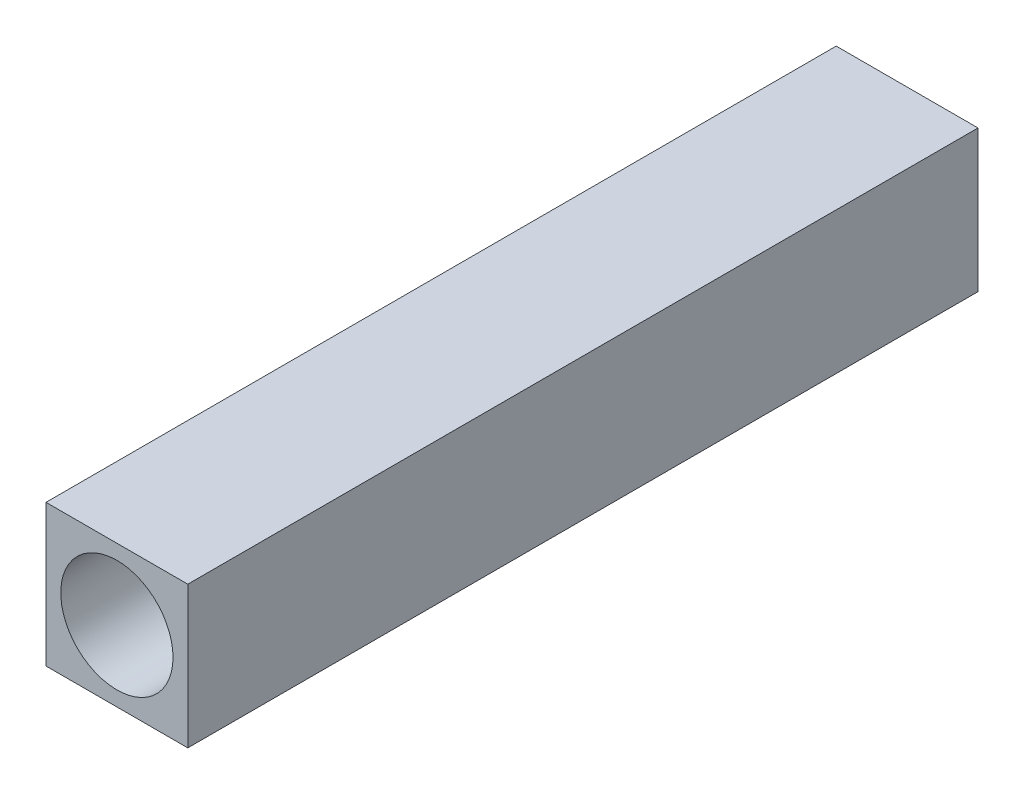
ISO-10303-21;
HEADER;
FILE_DESCRIPTION(('STEP AP214'),'2;1');
FILE_NAME('part.step','',(''),(''),'','','');
FILE_SCHEMA(('AUTOMOTIVE_DESIGN { 1 0 10303 214 1 1 1 1 }'));
ENDSEC;
DATA;
#1=APPLICATION_CONTEXT('core data for automotive mechanical design processes');
#2=APPLICATION_PROTOCOL_DEFINITION('international standard','automotive_design',2000,#1);
#3=PRODUCT_CONTEXT('',#1,'mechanical');
#4=PRODUCT('Part','Part','',(#3));
#5=PRODUCT_RELATED_PRODUCT_CATEGORY('part','',(#4));
#6=PRODUCT_DEFINITION_FORMATION('','',#4);
#7=PRODUCT_DEFINITION_CONTEXT('part definition',#1,'design');
#8=PRODUCT_DEFINITION('design','',#6,#7);
#9=PRODUCT_DEFINITION_SHAPE('','',#8);
#10=(LENGTH_UNIT() NAMED_UNIT(*) SI_UNIT(.MILLI.,.METRE.));
#11=(NAMED_UNIT(*) PLANE_ANGLE_UNIT() SI_UNIT($,.RADIAN.));
#12=(NAMED_UNIT(*) SI_UNIT($,.STERADIAN.) SOLID_ANGLE_UNIT());
#13=UNCERTAINTY_MEASURE_WITH_UNIT(LENGTH_MEASURE(1.E-05),#10,'distance_accuracy_value','');
#14=(GEOMETRIC_REPRESENTATION_CONTEXT(3) GLOBAL_UNCERTAINTY_ASSIGNED_CONTEXT((#13)) GLOBAL_UNIT_ASSIGNED_CONTEXT((#10,
#11,#12)) REPRESENTATION_CONTEXT('',''));
#15=CARTESIAN_POINT('',(0.,0.,0.));
#16=DIRECTION('',(0.,0.,1.));
#17=DIRECTION('',(1.,0.,0.));
#18=AXIS2_PLACEMENT_3D('',#15,#16,#17);
#19=CARTESIAN_POINT('',(0.,0.,135.89));
#20=DIRECTION('',(0.,0.,1.));
#21=DIRECTION('',(1.,0.,0.));
#22=AXIS2_PLACEMENT_3D('',#19,#20,#21);
#23=PLANE('',#22);
#24=DIRECTION('',(0.,-1.,0.));
#25=VECTOR('',#24,1.);
#26=CARTESIAN_POINT('',(12.192,12.192,135.89));
#27=LINE('',#26,#25);
#28=CARTESIAN_POINT('',(12.192,12.192,135.89));
#29=VERTEX_POINT('',#28);
#30=CARTESIAN_POINT('',(12.192,-12.192,135.89));
#31=VERTEX_POINT('',#30);
#32=EDGE_CURVE('E50',#29,#31,#27,.T.);
#33=ORIENTED_EDGE('',*,*,#32,.F.);
#34=DIRECTION('',(1.,0.,0.));
#35=VECTOR('',#34,1.);
#36=CARTESIAN_POINT('',(12.192,12.192,135.89));
#37=LINE('',#36,#35);
#38=CARTESIAN_POINT('',(-12.192,12.192,135.89));
#39=VERTEX_POINT('',#38);
#40=EDGE_CURVE('E79',#39,#29,#37,.T.);
#41=ORIENTED_EDGE('',*,*,#40,.F.);
#42=DIRECTION('',(0.,1.,0.));
#43=VECTOR('',#42,1.);
#44=CARTESIAN_POINT('',(-12.192,12.192,135.89));
#45=LINE('',#44,#43);
#46=CARTESIAN_POINT('',(-12.192,-12.192,135.89));
#47=VERTEX_POINT('',#46);
#48=EDGE_CURVE('E77',#47,#39,#45,.T.);
#49=ORIENTED_EDGE('',*,*,#48,.F.);
#50=DIRECTION('',(-1.,0.,0.));
#51=VECTOR('',#50,1.);
#52=CARTESIAN_POINT('',(12.192,-12.192,135.89));
#53=LINE('',#52,#51);
#54=EDGE_CURVE('E75',#31,#47,#53,.T.);
#55=ORIENTED_EDGE('',*,*,#54,.F.);
#56=EDGE_LOOP('',(#33,#41,#49,#55));
#57=FACE_BOUND('',#56,.T.);
#58=CARTESIAN_POINT('',(0.,0.,135.89));
#59=DIRECTION('',(0.,0.,1.));
#60=DIRECTION('',(1.,0.,0.));
#61=AXIS2_PLACEMENT_3D('',#58,#59,#60);
#62=CIRCLE('',#61,9.652);
#63=CARTESIAN_POINT('',(9.652,0.,135.89));
#64=VERTEX_POINT('',#63);
#65=EDGE_CURVE('E11',#64,#64,#62,.T.);
#66=ORIENTED_EDGE('',*,*,#65,.F.);
#67=EDGE_LOOP('',(#66));
#68=FACE_BOUND('',#67,.T.);
#69=ADVANCED_FACE('F33',(#57,#68),#23,.T.);
#70=CARTESIAN_POINT('',(0.,0.,0.));
#71=DIRECTION('',(0.,0.,1.));
#72=DIRECTION('',(1.,0.,0.));
#73=AXIS2_PLACEMENT_3D('',#70,#71,#72);
#74=PLANE('',#73);
#75=DIRECTION('',(-1.,0.,0.));
#76=VECTOR('',#75,1.);
#77=CARTESIAN_POINT('',(12.192,-12.192,0.));
#78=LINE('',#77,#76);
#79=CARTESIAN_POINT('',(12.192,-12.192,0.));
#80=VERTEX_POINT('',#79);
#81=CARTESIAN_POINT('',(-12.192,-12.192,0.));
#82=VERTEX_POINT('',#81);
#83=EDGE_CURVE('E103',#80,#82,#78,.T.);
#84=ORIENTED_EDGE('',*,*,#83,.T.);
#85=DIRECTION('',(0.,1.,0.));
#86=VECTOR('',#85,1.);
#87=CARTESIAN_POINT('',(-12.192,12.192,0.));
#88=LINE('',#87,#86);
#89=CARTESIAN_POINT('',(-12.192,12.192,0.));
#90=VERTEX_POINT('',#89);
#91=EDGE_CURVE('E66',#82,#90,#88,.T.);
#92=ORIENTED_EDGE('',*,*,#91,.T.);
#93=DIRECTION('',(1.,0.,0.));
#94=VECTOR('',#93,1.);
#95=CARTESIAN_POINT('',(12.192,12.192,0.));
#96=LINE('',#95,#94);
#97=CARTESIAN_POINT('',(12.192,12.192,0.));
#98=VERTEX_POINT('',#97);
#99=EDGE_CURVE('E70',#90,#98,#96,.T.);
#100=ORIENTED_EDGE('',*,*,#99,.T.);
#101=DIRECTION('',(0.,-1.,0.));
#102=VECTOR('',#101,1.);
#103=CARTESIAN_POINT('',(12.192,12.192,0.));
#104=LINE('',#103,#102);
#105=EDGE_CURVE('E105',#98,#80,#104,.T.);
#106=ORIENTED_EDGE('',*,*,#105,.T.);
#107=EDGE_LOOP('',(#84,#92,#100,#106));
#108=FACE_BOUND('',#107,.T.);
#109=CARTESIAN_POINT('',(0.,0.,0.));
#110=DIRECTION('',(0.,0.,1.));
#111=DIRECTION('',(1.,0.,0.));
#112=AXIS2_PLACEMENT_3D('',#109,#110,#111);
#113=CIRCLE('',#112,9.652);
#114=CARTESIAN_POINT('',(9.652,0.,0.));
#115=VERTEX_POINT('',#114);
#116=EDGE_CURVE('E37',#115,#115,#113,.T.);
#117=ORIENTED_EDGE('',*,*,#116,.T.);
#118=EDGE_LOOP('',(#117));
#119=FACE_BOUND('',#118,.T.);
#120=ADVANCED_FACE('F35',(#108,#119),#74,.F.);
#121=CARTESIAN_POINT('',(0.,0.,135.89));
#122=DIRECTION('',(0.,0.,-1.));
#123=DIRECTION('',(-1.,0.,0.));
#124=AXIS2_PLACEMENT_3D('',#121,#122,#123);
#125=CYLINDRICAL_SURFACE('',#124,9.652);
#126=ORIENTED_EDGE('',*,*,#65,.T.);
#127=EDGE_LOOP('',(#126));
#128=FACE_BOUND('',#127,.T.);
#129=ORIENTED_EDGE('',*,*,#116,.F.);
#130=EDGE_LOOP('',(#129));
#131=FACE_BOUND('',#130,.T.);
#132=ADVANCED_FACE('F121',(#128,#131),#125,.F.);
#133=CARTESIAN_POINT('',(12.192,12.192,135.89));
#134=DIRECTION('',(1.,0.,0.));
#135=DIRECTION('',(0.,1.,0.));
#136=AXIS2_PLACEMENT_3D('',#133,#134,#135);
#137=PLANE('',#136);
#138=DIRECTION('',(0.,0.,-1.));
#139=VECTOR('',#138,1.);
#140=CARTESIAN_POINT('',(12.192,-12.192,135.89));
#141=LINE('',#140,#139);
#142=EDGE_CURVE('E91',#31,#80,#141,.T.);
#143=ORIENTED_EDGE('',*,*,#142,.T.);
#144=ORIENTED_EDGE('',*,*,#105,.F.);
#145=DIRECTION('',(0.,0.,-1.));
#146=VECTOR('',#145,1.);
#147=CARTESIAN_POINT('',(12.192,12.192,135.89));
#148=LINE('',#147,#146);
#149=EDGE_CURVE('E96',#29,#98,#148,.T.);
#150=ORIENTED_EDGE('',*,*,#149,.F.);
#151=ORIENTED_EDGE('',*,*,#32,.T.);
#152=EDGE_LOOP('',(#143,#144,#150,#151));
#153=FACE_BOUND('',#152,.T.);
#154=ADVANCED_FACE('F110',(#153),#137,.T.);
#155=CARTESIAN_POINT('',(12.192,12.192,135.89));
#156=DIRECTION('',(0.,1.,0.));
#157=DIRECTION('',(0.,0.,1.));
#158=AXIS2_PLACEMENT_3D('',#155,#156,#157);
#159=PLANE('',#158);
#160=ORIENTED_EDGE('',*,*,#149,.T.);
#161=ORIENTED_EDGE('',*,*,#99,.F.);
#162=DIRECTION('',(0.,0.,-1.));
#163=VECTOR('',#162,1.);
#164=CARTESIAN_POINT('',(-12.192,12.192,135.89));
#165=LINE('',#164,#163);
#166=EDGE_CURVE('E94',#39,#90,#165,.T.);
#167=ORIENTED_EDGE('',*,*,#166,.F.);
#168=ORIENTED_EDGE('',*,*,#40,.T.);
#169=EDGE_LOOP('',(#160,#161,#167,#168));
#170=FACE_BOUND('',#169,.T.);
#171=ADVANCED_FACE('F113',(#170),#159,.T.);
#172=CARTESIAN_POINT('',(-12.192,12.192,135.89));
#173=DIRECTION('',(-1.,0.,0.));
#174=DIRECTION('',(0.,-1.,0.));
#175=AXIS2_PLACEMENT_3D('',#172,#173,#174);
#176=PLANE('',#175);
#177=ORIENTED_EDGE('',*,*,#91,.F.);
#178=DIRECTION('',(0.,0.,-1.));
#179=VECTOR('',#178,1.);
#180=CARTESIAN_POINT('',(-12.192,-12.192,135.89));
#181=LINE('',#180,#179);
#182=EDGE_CURVE('E89',#47,#82,#181,.T.);
#183=ORIENTED_EDGE('',*,*,#182,.F.);
#184=ORIENTED_EDGE('',*,*,#48,.T.);
#185=ORIENTED_EDGE('',*,*,#166,.T.);
#186=EDGE_LOOP('',(#177,#183,#184,#185));
#187=FACE_BOUND('',#186,.T.);
#188=ADVANCED_FACE('F93',(#187),#176,.T.);
#189=CARTESIAN_POINT('',(12.192,-12.192,135.89));
#190=DIRECTION('',(0.,-1.,0.));
#191=DIRECTION('',(0.,0.,-1.));
#192=AXIS2_PLACEMENT_3D('',#189,#190,#191);
#193=PLANE('',#192);
#194=ORIENTED_EDGE('',*,*,#182,.T.);
#195=ORIENTED_EDGE('',*,*,#83,.F.);
#196=ORIENTED_EDGE('',*,*,#142,.F.);
#197=ORIENTED_EDGE('',*,*,#54,.T.);
#198=EDGE_LOOP('',(#194,#195,#196,#197));
#199=FACE_BOUND('',#198,.T.);
#200=ADVANCED_FACE('F87',(#199),#193,.T.);
#201=CLOSED_SHELL('',(#69,#120,#132,#154,#171,#188,#200));
#202=MANIFOLD_SOLID_BREP('B2',#201);
#203=ADVANCED_BREP_SHAPE_REPRESENTATION('',(#18,#202),#14);
#204=SHAPE_DEFINITION_REPRESENTATION(#9,#203);
ENDSEC;
END-ISO-10303-21;
